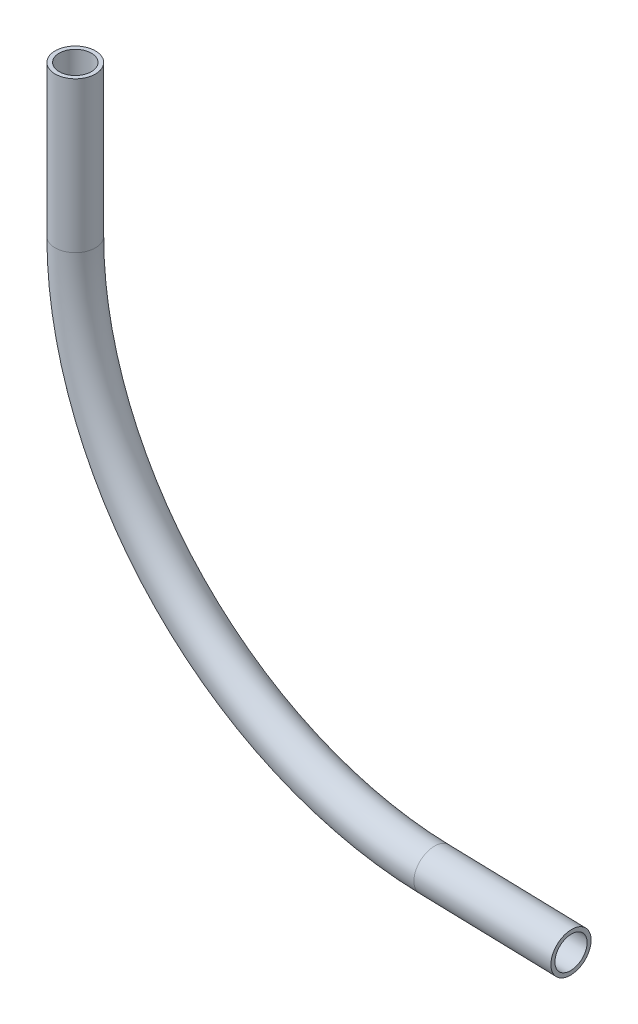
ISO-10303-21;
HEADER;
FILE_DESCRIPTION(('STEP AP214'),'2;1');
FILE_NAME('part.step','',(''),(''),'','','');
FILE_SCHEMA(('AUTOMOTIVE_DESIGN { 1 0 10303 214 1 1 1 1 }'));
ENDSEC;
DATA;
#1=APPLICATION_CONTEXT('core data for automotive mechanical design processes');
#2=APPLICATION_PROTOCOL_DEFINITION('international standard','automotive_design',2000,#1);
#3=PRODUCT_CONTEXT('',#1,'mechanical');
#4=PRODUCT('Part','Part','',(#3));
#5=PRODUCT_RELATED_PRODUCT_CATEGORY('part','',(#4));
#6=PRODUCT_DEFINITION_FORMATION('','',#4);
#7=PRODUCT_DEFINITION_CONTEXT('part definition',#1,'design');
#8=PRODUCT_DEFINITION('design','',#6,#7);
#9=PRODUCT_DEFINITION_SHAPE('','',#8);
#10=(LENGTH_UNIT() NAMED_UNIT(*) SI_UNIT(.MILLI.,.METRE.));
#11=(NAMED_UNIT(*) PLANE_ANGLE_UNIT() SI_UNIT($,.RADIAN.));
#12=(NAMED_UNIT(*) SI_UNIT($,.STERADIAN.) SOLID_ANGLE_UNIT());
#13=UNCERTAINTY_MEASURE_WITH_UNIT(LENGTH_MEASURE(1.E-05),#10,'distance_accuracy_value','');
#14=(GEOMETRIC_REPRESENTATION_CONTEXT(3) GLOBAL_UNCERTAINTY_ASSIGNED_CONTEXT((#13)) GLOBAL_UNIT_ASSIGNED_CONTEXT((#10,
#11,#12)) REPRESENTATION_CONTEXT('',''));
#15=CARTESIAN_POINT('',(0.,0.,0.));
#16=DIRECTION('',(0.,0.,1.));
#17=DIRECTION('',(1.,0.,0.));
#18=AXIS2_PLACEMENT_3D('',#15,#16,#17);
#19=CARTESIAN_POINT('',(0.,107.830938620693,0.));
#20=DIRECTION('',(0.,1.,0.));
#21=DIRECTION('',(0.,0.,1.));
#22=AXIS2_PLACEMENT_3D('',#19,#20,#21);
#23=CYLINDRICAL_SURFACE('',#22,3.81);
#24=CARTESIAN_POINT('',(0.,110.370938620693,0.));
#25=DIRECTION('',(0.,1.,0.));
#26=DIRECTION('',(0.,0.,1.));
#27=AXIS2_PLACEMENT_3D('',#24,#25,#26);
#28=CIRCLE('',#27,3.81);
#29=CARTESIAN_POINT('',(0.,110.370938620693,3.81));
#30=VERTEX_POINT('',#29);
#31=EDGE_CURVE('E10',#30,#30,#28,.T.);
#32=ORIENTED_EDGE('',*,*,#31,.F.);
#33=EDGE_LOOP('',(#32));
#34=FACE_BOUND('',#33,.T.);
#35=CARTESIAN_POINT('',(0.,81.8399496835882,0.));
#36=DIRECTION('',(0.,1.,0.));
#37=DIRECTION('',(0.,0.,1.));
#38=AXIS2_PLACEMENT_3D('',#35,#36,#37);
#39=CIRCLE('',#38,3.81);
#40=CARTESIAN_POINT('',(-3.80999999999999,81.8399496835882,0.));
#41=VERTEX_POINT('',#40);
#42=EDGE_CURVE('E53',#41,#41,#39,.T.);
#43=ORIENTED_EDGE('',*,*,#42,.T.);
#44=EDGE_LOOP('',(#43));
#45=FACE_BOUND('',#44,.T.);
#46=ADVANCED_FACE('F28',(#34,#45),#23,.T.);
#47=CARTESIAN_POINT('',(0.,110.370938620693,0.));
#48=DIRECTION('',(0.,1.,0.));
#49=DIRECTION('',(0.,0.,1.));
#50=AXIS2_PLACEMENT_3D('',#47,#48,#49);
#51=PLANE('',#50);
#52=CARTESIAN_POINT('',(0.,110.370938620693,0.));
#53=DIRECTION('',(0.,1.,0.));
#54=DIRECTION('',(0.,0.,1.));
#55=AXIS2_PLACEMENT_3D('',#52,#53,#54);
#56=CIRCLE('',#55,3.048);
#57=CARTESIAN_POINT('',(0.,110.370938620693,3.048));
#58=VERTEX_POINT('',#57);
#59=EDGE_CURVE('E34',#58,#58,#56,.T.);
#60=ORIENTED_EDGE('',*,*,#59,.F.);
#61=EDGE_LOOP('',(#60));
#62=FACE_BOUND('',#61,.T.);
#63=ORIENTED_EDGE('',*,*,#31,.T.);
#64=EDGE_LOOP('',(#63));
#65=FACE_BOUND('',#64,.T.);
#66=ADVANCED_FACE('F66',(#62,#65),#51,.T.);
#67=CARTESIAN_POINT('',(0.,107.830938620693,0.));
#68=DIRECTION('',(0.,1.,0.));
#69=DIRECTION('',(0.,0.,1.));
#70=AXIS2_PLACEMENT_3D('',#67,#68,#69);
#71=CYLINDRICAL_SURFACE('',#70,3.048);
#72=ORIENTED_EDGE('',*,*,#59,.T.);
#73=EDGE_LOOP('',(#72));
#74=FACE_BOUND('',#73,.T.);
#75=CARTESIAN_POINT('',(0.,81.8399496835882,0.));
#76=DIRECTION('',(0.,1.,0.));
#77=DIRECTION('',(0.,0.,1.));
#78=AXIS2_PLACEMENT_3D('',#75,#76,#77);
#79=CIRCLE('',#78,3.048);
#80=CARTESIAN_POINT('',(-3.048,81.8399496835882,0.));
#81=VERTEX_POINT('',#80);
#82=EDGE_CURVE('E56',#81,#81,#79,.T.);
#83=ORIENTED_EDGE('',*,*,#82,.F.);
#84=EDGE_LOOP('',(#83));
#85=FACE_BOUND('',#84,.T.);
#86=ADVANCED_FACE('F63',(#74,#85),#71,.F.);
#87=CARTESIAN_POINT('',(67.9642292628344,12.0154098087931,0.));
#88=DIRECTION('',(0.999635502860345,-0.0269974336029433,0.));
#89=DIRECTION('',(0.0269974336029433,0.999635502860345,0.));
#90=AXIS2_PLACEMENT_3D('',#87,#88,#89);
#91=CYLINDRICAL_SURFACE('',#90,3.81);
#92=CARTESIAN_POINT('',(67.9642292628344,12.0154098087931,0.));
#93=DIRECTION('',(-0.999635502860345,0.0269974336029436,0.));
#94=DIRECTION('',(0.,0.,1.));
#95=AXIS2_PLACEMENT_3D('',#92,#93,#94);
#96=CIRCLE('',#95,3.81);
#97=CARTESIAN_POINT('',(67.8613690408072,8.20679854289515,0.));
#98=VERTEX_POINT('',#97);
#99=EDGE_CURVE('E47',#98,#98,#96,.T.);
#100=ORIENTED_EDGE('',*,*,#99,.F.);
#101=EDGE_LOOP('',(#100));
#102=FACE_BOUND('',#101,.T.);
#103=CARTESIAN_POINT('',(93.926499612434,11.3142395642996,0.));
#104=DIRECTION('',(-0.999635502860345,0.0269974336029436,0.));
#105=DIRECTION('',(0.,0.,1.));
#106=AXIS2_PLACEMENT_3D('',#103,#104,#105);
#107=CIRCLE('',#106,3.81);
#108=CARTESIAN_POINT('',(93.926499612434,11.3142395642996,3.81));
#109=VERTEX_POINT('',#108);
#110=EDGE_CURVE('E38',#109,#109,#107,.T.);
#111=ORIENTED_EDGE('',*,*,#110,.T.);
#112=EDGE_LOOP('',(#111));
#113=FACE_BOUND('',#112,.T.);
#114=ADVANCED_FACE('F65',(#102,#113),#91,.T.);
#115=CARTESIAN_POINT('',(67.9642292628344,12.0154098087931,0.));
#116=DIRECTION('',(0.999635502860345,-0.0269974336029433,0.));
#117=DIRECTION('',(0.0269974336029433,0.999635502860345,0.));
#118=AXIS2_PLACEMENT_3D('',#115,#116,#117);
#119=CYLINDRICAL_SURFACE('',#118,3.048);
#120=CARTESIAN_POINT('',(67.9642292628344,12.0154098087931,0.));
#121=DIRECTION('',(-0.999635502860345,0.0269974336029436,0.));
#122=DIRECTION('',(0.,0.,1.));
#123=AXIS2_PLACEMENT_3D('',#120,#121,#122);
#124=CIRCLE('',#123,3.048);
#125=CARTESIAN_POINT('',(67.8819410852126,8.96852079607474,0.));
#126=VERTEX_POINT('',#125);
#127=EDGE_CURVE('E50',#126,#126,#124,.T.);
#128=ORIENTED_EDGE('',*,*,#127,.T.);
#129=EDGE_LOOP('',(#128));
#130=FACE_BOUND('',#129,.T.);
#131=CARTESIAN_POINT('',(93.926499612434,11.3142395642996,0.));
#132=DIRECTION('',(-0.999635502860345,0.0269974336029436,0.));
#133=DIRECTION('',(0.,0.,1.));
#134=AXIS2_PLACEMENT_3D('',#131,#132,#133);
#135=CIRCLE('',#134,3.048);
#136=CARTESIAN_POINT('',(93.926499612434,11.3142395642996,3.048));
#137=VERTEX_POINT('',#136);
#138=EDGE_CURVE('E42',#137,#137,#135,.T.);
#139=ORIENTED_EDGE('',*,*,#138,.F.);
#140=EDGE_LOOP('',(#139));
#141=FACE_BOUND('',#140,.T.);
#142=ADVANCED_FACE('F72',(#130,#141),#119,.F.);
#143=CARTESIAN_POINT('',(69.85,81.8399496835882,0.));
#144=DIRECTION('',(0.,0.,1.));
#145=DIRECTION('',(1.,0.,0.));
#146=AXIS2_PLACEMENT_3D('',#143,#144,#145);
#147=TOROIDAL_SURFACE('',#146,69.85,3.81);
#148=CARTESIAN_POINT('',(69.85,81.8399496835882,0.));
#149=DIRECTION('',(0.,0.,1.));
#150=DIRECTION('',(1.,0.,0.));
#151=AXIS2_PLACEMENT_3D('',#148,#149,#150);
#152=CIRCLE('',#151,73.66);
#153=EDGE_CURVE('',#41,#98,#152,.T.);
#154=ORIENTED_EDGE('',*,*,#42,.F.);
#155=ORIENTED_EDGE('',*,*,#99,.T.);
#156=ORIENTED_EDGE('',*,*,#153,.T.);
#157=ORIENTED_EDGE('',*,*,#153,.F.);
#158=EDGE_LOOP('',(#154,#156,#155,#157));
#159=FACE_BOUND('',#158,.T.);
#160=ADVANCED_FACE('F83',(#159),#147,.T.);
#161=CARTESIAN_POINT('',(69.85,81.8399496835882,0.));
#162=DIRECTION('',(0.,0.,1.));
#163=DIRECTION('',(1.,0.,0.));
#164=AXIS2_PLACEMENT_3D('',#161,#162,#163);
#165=TOROIDAL_SURFACE('',#164,69.85,3.048);
#166=CARTESIAN_POINT('',(69.85,81.8399496835882,0.));
#167=DIRECTION('',(0.,0.,1.));
#168=DIRECTION('',(1.,0.,0.));
#169=AXIS2_PLACEMENT_3D('',#166,#167,#168);
#170=CIRCLE('',#169,72.898);
#171=EDGE_CURVE('',#81,#126,#170,.T.);
#172=ORIENTED_EDGE('',*,*,#82,.T.);
#173=ORIENTED_EDGE('',*,*,#127,.F.);
#174=ORIENTED_EDGE('',*,*,#171,.T.);
#175=ORIENTED_EDGE('',*,*,#171,.F.);
#176=EDGE_LOOP('',(#172,#174,#173,#175));
#177=FACE_BOUND('',#176,.T.);
#178=ADVANCED_FACE('F60',(#177),#165,.F.);
#179=CARTESIAN_POINT('',(93.926499612434,11.3142395642996,0.));
#180=DIRECTION('',(-0.999635502860345,0.0269974336029436,0.));
#181=DIRECTION('',(0.,0.,1.));
#182=AXIS2_PLACEMENT_3D('',#179,#180,#181);
#183=PLANE('',#182);
#184=ORIENTED_EDGE('',*,*,#138,.T.);
#185=EDGE_LOOP('',(#184));
#186=FACE_BOUND('',#185,.T.);
#187=ORIENTED_EDGE('',*,*,#110,.F.);
#188=EDGE_LOOP('',(#187));
#189=FACE_BOUND('',#188,.T.);
#190=ADVANCED_FACE('F91',(#186,#189),#183,.F.);
#191=CLOSED_SHELL('',(#46,#66,#86,#114,#142,#160,#178,#190));
#192=MANIFOLD_SOLID_BREP('B2',#191);
#193=ADVANCED_BREP_SHAPE_REPRESENTATION('',(#18,#192),#14);
#194=SHAPE_DEFINITION_REPRESENTATION(#9,#193);
ENDSEC;
END-ISO-10303-21;
